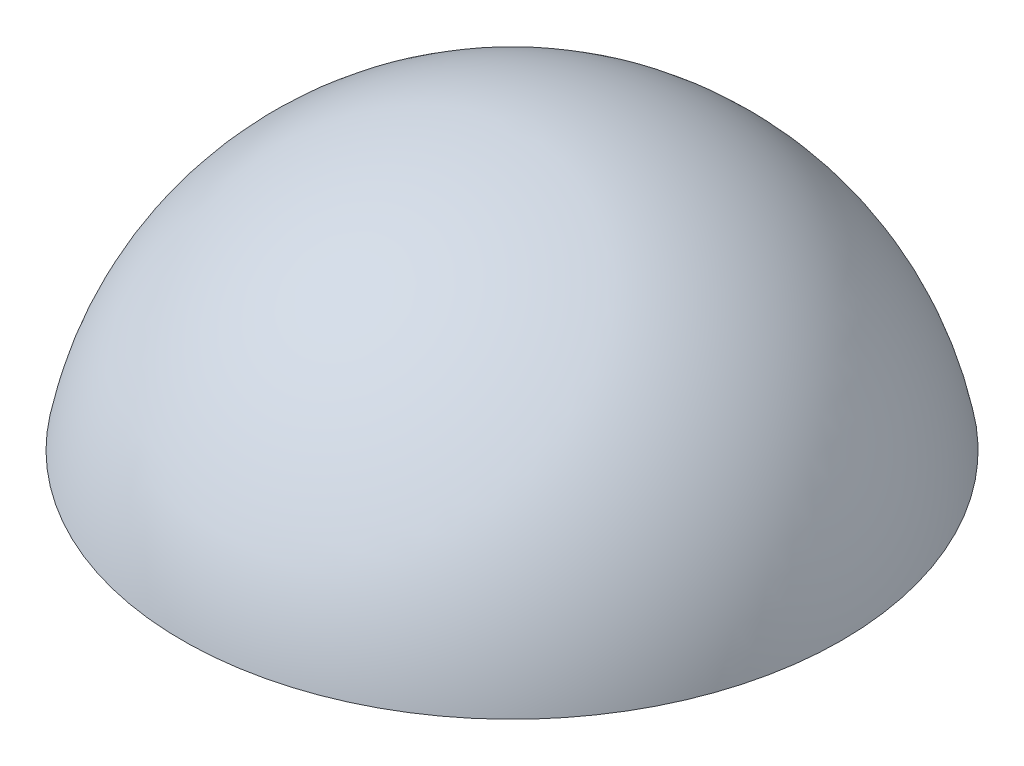
ISO-10303-21;
HEADER;
FILE_DESCRIPTION(('STEP AP214'),'2;1');
FILE_NAME('part.step','',(''),(''),'','','');
FILE_SCHEMA(('AUTOMOTIVE_DESIGN { 1 0 10303 214 1 1 1 1 }'));
ENDSEC;
DATA;
#1=APPLICATION_CONTEXT('core data for automotive mechanical design processes');
#2=APPLICATION_PROTOCOL_DEFINITION('international standard','automotive_design',2000,#1);
#3=PRODUCT_CONTEXT('',#1,'mechanical');
#4=PRODUCT('Part','Part','',(#3));
#5=PRODUCT_RELATED_PRODUCT_CATEGORY('part','',(#4));
#6=PRODUCT_DEFINITION_FORMATION('','',#4);
#7=PRODUCT_DEFINITION_CONTEXT('part definition',#1,'design');
#8=PRODUCT_DEFINITION('design','',#6,#7);
#9=PRODUCT_DEFINITION_SHAPE('','',#8);
#10=(LENGTH_UNIT() NAMED_UNIT(*) SI_UNIT(.MILLI.,.METRE.));
#11=(NAMED_UNIT(*) PLANE_ANGLE_UNIT() SI_UNIT($,.RADIAN.));
#12=(NAMED_UNIT(*) SI_UNIT($,.STERADIAN.) SOLID_ANGLE_UNIT());
#13=UNCERTAINTY_MEASURE_WITH_UNIT(LENGTH_MEASURE(1.E-05),#10,'distance_accuracy_value','');
#14=(GEOMETRIC_REPRESENTATION_CONTEXT(3) GLOBAL_UNCERTAINTY_ASSIGNED_CONTEXT((#13)) GLOBAL_UNIT_ASSIGNED_CONTEXT((#10,
#11,#12)) REPRESENTATION_CONTEXT('',''));
#15=CARTESIAN_POINT('',(0.,0.,0.));
#16=DIRECTION('',(0.,0.,1.));
#17=DIRECTION('',(1.,0.,0.));
#18=AXIS2_PLACEMENT_3D('',#15,#16,#17);
#19=CARTESIAN_POINT('',(0.,0.,0.));
#20=DIRECTION('',(0.,1.,0.));
#21=DIRECTION('',(1.,0.,0.));
#22=AXIS2_PLACEMENT_3D('',#19,#20,#21);
#23=SPHERICAL_SURFACE('',#22,838.2);
#24=CARTESIAN_POINT('',(0.,152.4,0.));
#25=DIRECTION('',(0.,1.,0.));
#26=DIRECTION('',(-1.,0.,0.));
#27=AXIS2_PLACEMENT_3D('',#24,#25,#26);
#28=CIRCLE('',#27,824.229021571068);
#29=CARTESIAN_POINT('',(-798.788607830632,152.4,203.2));
#30=VERTEX_POINT('',#29);
#31=CARTESIAN_POINT('',(-798.788607830632,152.4,-203.2));
#32=VERTEX_POINT('',#31);
#33=EDGE_CURVE('E11',#30,#32,#28,.T.);
#34=ORIENTED_EDGE('',*,*,#33,.T.);
#35=CARTESIAN_POINT('',(-798.788607830633,0.,0.));
#36=DIRECTION('',(1.,0.,0.));
#37=DIRECTION('',(0.,0.,-1.));
#38=AXIS2_PLACEMENT_3D('',#35,#36,#37);
#39=CIRCLE('',#38,254.);
#40=EDGE_CURVE('E59',#30,#32,#39,.F.);
#41=ORIENTED_EDGE('',*,*,#40,.F.);
#42=EDGE_LOOP('',(#34,#41));
#43=FACE_BOUND('',#42,.T.);
#44=ADVANCED_FACE('F39',(#43),#23,.T.);
#45=CARTESIAN_POINT('',(0.,152.4,0.));
#46=DIRECTION('',(0.,1.,0.));
#47=DIRECTION('',(-1.,0.,0.));
#48=AXIS2_PLACEMENT_3D('',#45,#46,#47);
#49=PLANE('',#48);
#50=ORIENTED_EDGE('',*,*,#33,.F.);
#51=DIRECTION('',(1.,0.,0.));
#52=VECTOR('',#51,1.);
#53=CARTESIAN_POINT('',(-824.230021571068,152.4,203.2));
#54=LINE('',#53,#52);
#55=CARTESIAN_POINT('',(-718.420489685532,152.4,203.199999999999));
#56=VERTEX_POINT('',#55);
#57=EDGE_CURVE('E66',#56,#30,#54,.F.);
#58=ORIENTED_EDGE('',*,*,#57,.F.);
#59=CARTESIAN_POINT('',(0.,152.4,0.));
#60=DIRECTION('',(0.,1.,0.));
#61=DIRECTION('',(-1.,0.,0.));
#62=AXIS2_PLACEMENT_3D('',#59,#60,#61);
#63=CIRCLE('',#62,746.604473600313);
#64=CARTESIAN_POINT('',(-718.420489685532,152.4,-203.199999999999));
#65=VERTEX_POINT('',#64);
#66=EDGE_CURVE('E47',#56,#65,#63,.T.);
#67=ORIENTED_EDGE('',*,*,#66,.T.);
#68=DIRECTION('',(1.,0.,0.));
#69=VECTOR('',#68,1.);
#70=CARTESIAN_POINT('',(-824.230021571068,152.4,-203.2));
#71=LINE('',#70,#69);
#72=EDGE_CURVE('E54',#32,#65,#71,.T.);
#73=ORIENTED_EDGE('',*,*,#72,.F.);
#74=EDGE_LOOP('',(#50,#58,#67,#73));
#75=FACE_BOUND('',#74,.T.);
#76=ADVANCED_FACE('F74',(#75),#49,.F.);
#77=CARTESIAN_POINT('',(0.,0.,0.));
#78=DIRECTION('',(0.,1.,0.));
#79=DIRECTION('',(1.,0.,0.));
#80=AXIS2_PLACEMENT_3D('',#77,#78,#79);
#81=SPHERICAL_SURFACE('',#80,762.);
#82=CARTESIAN_POINT('',(-718.420489685532,0.,0.));
#83=DIRECTION('',(1.,0.,0.));
#84=DIRECTION('',(0.,0.,-1.));
#85=AXIS2_PLACEMENT_3D('',#82,#83,#84);
#86=CIRCLE('',#85,254.);
#87=EDGE_CURVE('E63',#56,#65,#86,.F.);
#88=ORIENTED_EDGE('',*,*,#87,.T.);
#89=ORIENTED_EDGE('',*,*,#66,.F.);
#90=EDGE_LOOP('',(#88,#89));
#91=FACE_BOUND('',#90,.T.);
#92=ADVANCED_FACE('F77',(#91),#81,.F.);
#93=CARTESIAN_POINT('',(-824.230021571068,0.,0.));
#94=DIRECTION('',(1.,0.,0.));
#95=DIRECTION('',(0.,0.,-1.));
#96=AXIS2_PLACEMENT_3D('',#93,#94,#95);
#97=CYLINDRICAL_SURFACE('',#96,254.);
#98=ORIENTED_EDGE('',*,*,#40,.T.);
#99=ORIENTED_EDGE('',*,*,#72,.T.);
#100=ORIENTED_EDGE('',*,*,#87,.F.);
#101=ORIENTED_EDGE('',*,*,#57,.T.);
#102=EDGE_LOOP('',(#98,#99,#100,#101));
#103=FACE_BOUND('',#102,.T.);
#104=ADVANCED_FACE('F65',(#103),#97,.F.);
#105=CLOSED_SHELL('',(#44,#76,#92,#104));
#106=MANIFOLD_SOLID_BREP('B2',#105);
#107=ADVANCED_BREP_SHAPE_REPRESENTATION('',(#18,#106),#14);
#108=SHAPE_DEFINITION_REPRESENTATION(#9,#107);
ENDSEC;
END-ISO-10303-21;
